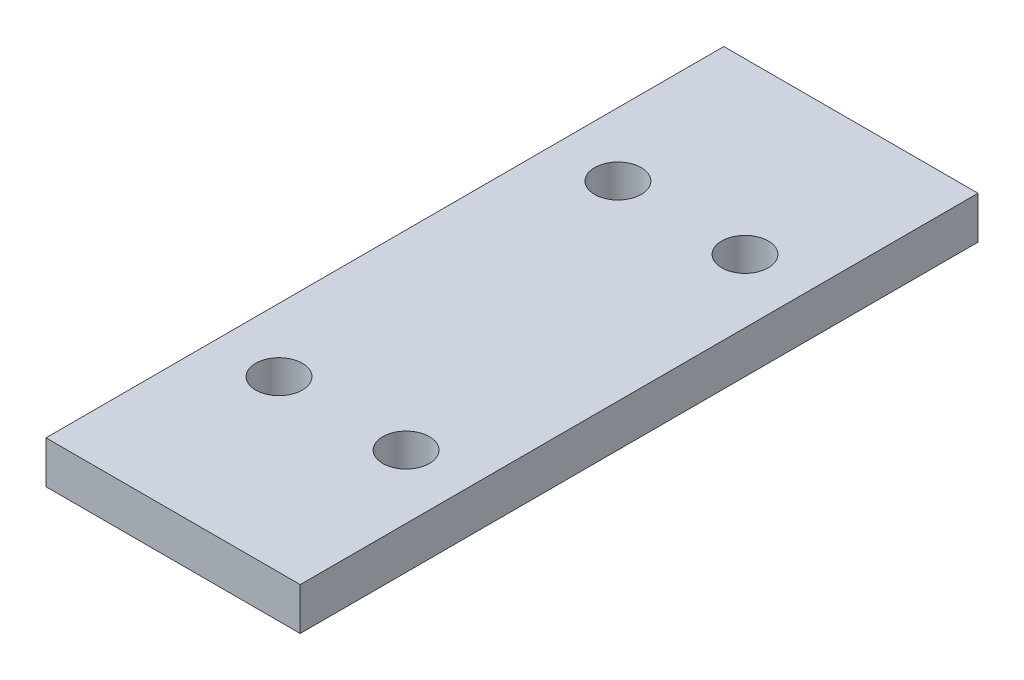
ISO-10303-21;
HEADER;
FILE_DESCRIPTION(('STEP AP214'),'2;1');
FILE_NAME('part.step','',(''),(''),'','','');
FILE_SCHEMA(('AUTOMOTIVE_DESIGN { 1 0 10303 214 1 1 1 1 }'));
ENDSEC;
DATA;
#1=APPLICATION_CONTEXT('core data for automotive mechanical design processes');
#2=APPLICATION_PROTOCOL_DEFINITION('international standard','automotive_design',2000,#1);
#3=PRODUCT_CONTEXT('',#1,'mechanical');
#4=PRODUCT('Part','Part','',(#3));
#5=PRODUCT_RELATED_PRODUCT_CATEGORY('part','',(#4));
#6=PRODUCT_DEFINITION_FORMATION('','',#4);
#7=PRODUCT_DEFINITION_CONTEXT('part definition',#1,'design');
#8=PRODUCT_DEFINITION('design','',#6,#7);
#9=PRODUCT_DEFINITION_SHAPE('','',#8);
#10=(LENGTH_UNIT() NAMED_UNIT(*) SI_UNIT(.MILLI.,.METRE.));
#11=(NAMED_UNIT(*) PLANE_ANGLE_UNIT() SI_UNIT($,.RADIAN.));
#12=(NAMED_UNIT(*) SI_UNIT($,.STERADIAN.) SOLID_ANGLE_UNIT());
#13=UNCERTAINTY_MEASURE_WITH_UNIT(LENGTH_MEASURE(1.E-05),#10,'distance_accuracy_value','');
#14=(GEOMETRIC_REPRESENTATION_CONTEXT(3) GLOBAL_UNCERTAINTY_ASSIGNED_CONTEXT((#13)) GLOBAL_UNIT_ASSIGNED_CONTEXT((#10,
#11,#12)) REPRESENTATION_CONTEXT('',''));
#15=CARTESIAN_POINT('',(0.,0.,0.));
#16=DIRECTION('',(0.,0.,1.));
#17=DIRECTION('',(1.,0.,0.));
#18=AXIS2_PLACEMENT_3D('',#15,#16,#17);
#19=CARTESIAN_POINT('',(0.,6.35,0.));
#20=DIRECTION('',(0.,1.,0.));
#21=DIRECTION('',(0.,0.,1.));
#22=AXIS2_PLACEMENT_3D('',#19,#20,#21);
#23=PLANE('',#22);
#24=CARTESIAN_POINT('',(9.525,6.35,25.4));
#25=DIRECTION('',(0.,1.,0.));
#26=DIRECTION('',(0.,0.,1.));
#27=AXIS2_PLACEMENT_3D('',#24,#25,#26);
#28=CIRCLE('',#27,3.4925);
#29=CARTESIAN_POINT('',(9.525,6.35,28.8925));
#30=VERTEX_POINT('',#29);
#31=EDGE_CURVE('E142',#30,#30,#28,.T.);
#32=ORIENTED_EDGE('',*,*,#31,.F.);
#33=EDGE_LOOP('',(#32));
#34=FACE_BOUND('',#33,.T.);
#35=CARTESIAN_POINT('',(-9.525,6.35,-25.4));
#36=DIRECTION('',(0.,1.,0.));
#37=DIRECTION('',(0.,0.,1.));
#38=AXIS2_PLACEMENT_3D('',#35,#36,#37);
#39=CIRCLE('',#38,3.4925);
#40=CARTESIAN_POINT('',(-9.525,6.35,-21.9075));
#41=VERTEX_POINT('',#40);
#42=EDGE_CURVE('E112',#41,#41,#39,.T.);
#43=ORIENTED_EDGE('',*,*,#42,.F.);
#44=EDGE_LOOP('',(#43));
#45=FACE_BOUND('',#44,.T.);
#46=DIRECTION('',(0.,0.,-1.));
#47=VECTOR('',#46,1.);
#48=CARTESIAN_POINT('',(19.05,6.35,-50.8));
#49=LINE('',#48,#47);
#50=CARTESIAN_POINT('',(19.05,6.35,50.8));
#51=VERTEX_POINT('',#50);
#52=CARTESIAN_POINT('',(19.05,6.35,-50.8));
#53=VERTEX_POINT('',#52);
#54=EDGE_CURVE('E92',#51,#53,#49,.T.);
#55=ORIENTED_EDGE('',*,*,#54,.T.);
#56=DIRECTION('',(-1.,0.,0.));
#57=VECTOR('',#56,1.);
#58=CARTESIAN_POINT('',(-19.05,6.35,-50.8));
#59=LINE('',#58,#57);
#60=CARTESIAN_POINT('',(-19.05,6.35,-50.8));
#61=VERTEX_POINT('',#60);
#62=EDGE_CURVE('E87',#53,#61,#59,.T.);
#63=ORIENTED_EDGE('',*,*,#62,.T.);
#64=DIRECTION('',(0.,0.,1.));
#65=VECTOR('',#64,1.);
#66=CARTESIAN_POINT('',(-19.05,6.35,-50.8));
#67=LINE('',#66,#65);
#68=CARTESIAN_POINT('',(-19.05,6.35,50.8));
#69=VERTEX_POINT('',#68);
#70=EDGE_CURVE('E90',#61,#69,#67,.T.);
#71=ORIENTED_EDGE('',*,*,#70,.T.);
#72=DIRECTION('',(1.,0.,0.));
#73=VECTOR('',#72,1.);
#74=CARTESIAN_POINT('',(-19.05,6.35,50.8));
#75=LINE('',#74,#73);
#76=EDGE_CURVE('E57',#69,#51,#75,.T.);
#77=ORIENTED_EDGE('',*,*,#76,.T.);
#78=EDGE_LOOP('',(#55,#63,#71,#77));
#79=FACE_BOUND('',#78,.T.);
#80=CARTESIAN_POINT('',(9.525,6.35,-25.4));
#81=DIRECTION('',(0.,1.,0.));
#82=DIRECTION('',(0.,0.,1.));
#83=AXIS2_PLACEMENT_3D('',#80,#81,#82);
#84=CIRCLE('',#83,3.4925);
#85=CARTESIAN_POINT('',(9.525,6.35,-21.9075));
#86=VERTEX_POINT('',#85);
#87=EDGE_CURVE('E134',#86,#86,#84,.T.);
#88=ORIENTED_EDGE('',*,*,#87,.F.);
#89=EDGE_LOOP('',(#88));
#90=FACE_BOUND('',#89,.T.);
#91=CARTESIAN_POINT('',(-9.525,6.35,25.4));
#92=DIRECTION('',(0.,1.,0.));
#93=DIRECTION('',(0.,0.,1.));
#94=AXIS2_PLACEMENT_3D('',#91,#92,#93);
#95=CIRCLE('',#94,3.4925);
#96=CARTESIAN_POINT('',(-9.525,6.35,28.8925));
#97=VERTEX_POINT('',#96);
#98=EDGE_CURVE('E150',#97,#97,#95,.T.);
#99=ORIENTED_EDGE('',*,*,#98,.F.);
#100=EDGE_LOOP('',(#99));
#101=FACE_BOUND('',#100,.T.);
#102=ADVANCED_FACE('F39',(#34,#45,#79,#90,#101),#23,.T.);
#103=CARTESIAN_POINT('',(0.,0.,0.));
#104=DIRECTION('',(0.,1.,0.));
#105=DIRECTION('',(0.,0.,1.));
#106=AXIS2_PLACEMENT_3D('',#103,#104,#105);
#107=PLANE('',#106);
#108=DIRECTION('',(0.,0.,-1.));
#109=VECTOR('',#108,1.);
#110=CARTESIAN_POINT('',(19.05,0.,-50.8));
#111=LINE('',#110,#109);
#112=CARTESIAN_POINT('',(19.05,0.,50.8));
#113=VERTEX_POINT('',#112);
#114=CARTESIAN_POINT('',(19.05,0.,-50.8));
#115=VERTEX_POINT('',#114);
#116=EDGE_CURVE('E108',#113,#115,#111,.T.);
#117=ORIENTED_EDGE('',*,*,#116,.F.);
#118=DIRECTION('',(1.,0.,0.));
#119=VECTOR('',#118,1.);
#120=CARTESIAN_POINT('',(-19.05,0.,50.8));
#121=LINE('',#120,#119);
#122=CARTESIAN_POINT('',(-19.05,0.,50.8));
#123=VERTEX_POINT('',#122);
#124=EDGE_CURVE('E80',#123,#113,#121,.T.);
#125=ORIENTED_EDGE('',*,*,#124,.F.);
#126=DIRECTION('',(0.,0.,1.));
#127=VECTOR('',#126,1.);
#128=CARTESIAN_POINT('',(-19.05,0.,-50.8));
#129=LINE('',#128,#127);
#130=CARTESIAN_POINT('',(-19.05,0.,-50.8));
#131=VERTEX_POINT('',#130);
#132=EDGE_CURVE('E74',#131,#123,#129,.T.);
#133=ORIENTED_EDGE('',*,*,#132,.F.);
#134=DIRECTION('',(-1.,0.,0.));
#135=VECTOR('',#134,1.);
#136=CARTESIAN_POINT('',(-19.05,0.,-50.8));
#137=LINE('',#136,#135);
#138=EDGE_CURVE('E97',#115,#131,#137,.T.);
#139=ORIENTED_EDGE('',*,*,#138,.F.);
#140=EDGE_LOOP('',(#117,#125,#133,#139));
#141=FACE_BOUND('',#140,.T.);
#142=CARTESIAN_POINT('',(-9.525,0.,-25.4));
#143=DIRECTION('',(0.,1.,0.));
#144=DIRECTION('',(0.,0.,1.));
#145=AXIS2_PLACEMENT_3D('',#142,#143,#144);
#146=CIRCLE('',#145,3.4925);
#147=CARTESIAN_POINT('',(-9.525,0.,-21.9075));
#148=VERTEX_POINT('',#147);
#149=EDGE_CURVE('E130',#148,#148,#146,.T.);
#150=ORIENTED_EDGE('',*,*,#149,.T.);
#151=EDGE_LOOP('',(#150));
#152=FACE_BOUND('',#151,.T.);
#153=CARTESIAN_POINT('',(9.525,0.,-25.4));
#154=DIRECTION('',(0.,1.,0.));
#155=DIRECTION('',(0.,0.,1.));
#156=AXIS2_PLACEMENT_3D('',#153,#154,#155);
#157=CIRCLE('',#156,3.4925);
#158=CARTESIAN_POINT('',(9.525,0.,-21.9075));
#159=VERTEX_POINT('',#158);
#160=EDGE_CURVE('E138',#159,#159,#157,.T.);
#161=ORIENTED_EDGE('',*,*,#160,.T.);
#162=EDGE_LOOP('',(#161));
#163=FACE_BOUND('',#162,.T.);
#164=CARTESIAN_POINT('',(9.525,0.,25.4));
#165=DIRECTION('',(0.,1.,0.));
#166=DIRECTION('',(0.,0.,1.));
#167=AXIS2_PLACEMENT_3D('',#164,#165,#166);
#168=CIRCLE('',#167,3.4925);
#169=CARTESIAN_POINT('',(9.525,0.,28.8925));
#170=VERTEX_POINT('',#169);
#171=EDGE_CURVE('E146',#170,#170,#168,.T.);
#172=ORIENTED_EDGE('',*,*,#171,.T.);
#173=EDGE_LOOP('',(#172));
#174=FACE_BOUND('',#173,.T.);
#175=CARTESIAN_POINT('',(-9.525,0.,25.4));
#176=DIRECTION('',(0.,1.,0.));
#177=DIRECTION('',(0.,0.,1.));
#178=AXIS2_PLACEMENT_3D('',#175,#176,#177);
#179=CIRCLE('',#178,3.4925);
#180=CARTESIAN_POINT('',(-9.525,0.,28.8925));
#181=VERTEX_POINT('',#180);
#182=EDGE_CURVE('E154',#181,#181,#179,.T.);
#183=ORIENTED_EDGE('',*,*,#182,.T.);
#184=EDGE_LOOP('',(#183));
#185=FACE_BOUND('',#184,.T.);
#186=ADVANCED_FACE('F125',(#141,#152,#163,#174,#185),#107,.F.);
#187=CARTESIAN_POINT('',(19.05,6.35,-50.8));
#188=DIRECTION('',(-1.,0.,0.));
#189=DIRECTION('',(0.,0.,1.));
#190=AXIS2_PLACEMENT_3D('',#187,#188,#189);
#191=PLANE('',#190);
#192=ORIENTED_EDGE('',*,*,#116,.T.);
#193=DIRECTION('',(0.,-1.,0.));
#194=VECTOR('',#193,1.);
#195=CARTESIAN_POINT('',(19.05,6.35,-50.8));
#196=LINE('',#195,#194);
#197=EDGE_CURVE('E11',#53,#115,#196,.T.);
#198=ORIENTED_EDGE('',*,*,#197,.F.);
#199=ORIENTED_EDGE('',*,*,#54,.F.);
#200=DIRECTION('',(0.,-1.,0.));
#201=VECTOR('',#200,1.);
#202=CARTESIAN_POINT('',(19.05,6.35,50.8));
#203=LINE('',#202,#201);
#204=EDGE_CURVE('E104',#51,#113,#203,.T.);
#205=ORIENTED_EDGE('',*,*,#204,.T.);
#206=EDGE_LOOP('',(#192,#198,#199,#205));
#207=FACE_BOUND('',#206,.T.);
#208=ADVANCED_FACE('F41',(#207),#191,.F.);
#209=CARTESIAN_POINT('',(-19.05,6.35,-50.8));
#210=DIRECTION('',(0.,0.,1.));
#211=DIRECTION('',(1.,0.,0.));
#212=AXIS2_PLACEMENT_3D('',#209,#210,#211);
#213=PLANE('',#212);
#214=ORIENTED_EDGE('',*,*,#138,.T.);
#215=DIRECTION('',(0.,-1.,0.));
#216=VECTOR('',#215,1.);
#217=CARTESIAN_POINT('',(-19.05,6.35,-50.8));
#218=LINE('',#217,#216);
#219=EDGE_CURVE('E49',#61,#131,#218,.T.);
#220=ORIENTED_EDGE('',*,*,#219,.F.);
#221=ORIENTED_EDGE('',*,*,#62,.F.);
#222=ORIENTED_EDGE('',*,*,#197,.T.);
#223=EDGE_LOOP('',(#214,#220,#221,#222));
#224=FACE_BOUND('',#223,.T.);
#225=ADVANCED_FACE('F96',(#224),#213,.F.);
#226=CARTESIAN_POINT('',(-19.05,6.35,-50.8));
#227=DIRECTION('',(1.,0.,0.));
#228=DIRECTION('',(0.,0.,-1.));
#229=AXIS2_PLACEMENT_3D('',#226,#227,#228);
#230=PLANE('',#229);
#231=ORIENTED_EDGE('',*,*,#132,.T.);
#232=DIRECTION('',(0.,-1.,0.));
#233=VECTOR('',#232,1.);
#234=CARTESIAN_POINT('',(-19.05,6.35,50.8));
#235=LINE('',#234,#233);
#236=EDGE_CURVE('E99',#69,#123,#235,.T.);
#237=ORIENTED_EDGE('',*,*,#236,.F.);
#238=ORIENTED_EDGE('',*,*,#70,.F.);
#239=ORIENTED_EDGE('',*,*,#219,.T.);
#240=EDGE_LOOP('',(#231,#237,#238,#239));
#241=FACE_BOUND('',#240,.T.);
#242=ADVANCED_FACE('F100',(#241),#230,.F.);
#243=CARTESIAN_POINT('',(-19.05,6.35,50.8));
#244=DIRECTION('',(0.,0.,-1.));
#245=DIRECTION('',(-1.,0.,0.));
#246=AXIS2_PLACEMENT_3D('',#243,#244,#245);
#247=PLANE('',#246);
#248=ORIENTED_EDGE('',*,*,#124,.T.);
#249=ORIENTED_EDGE('',*,*,#204,.F.);
#250=ORIENTED_EDGE('',*,*,#76,.F.);
#251=ORIENTED_EDGE('',*,*,#236,.T.);
#252=EDGE_LOOP('',(#248,#249,#250,#251));
#253=FACE_BOUND('',#252,.T.);
#254=ADVANCED_FACE('F122',(#253),#247,.F.);
#255=CARTESIAN_POINT('',(-9.525,6.35,-25.4));
#256=DIRECTION('',(0.,-1.,0.));
#257=DIRECTION('',(0.,0.,-1.));
#258=AXIS2_PLACEMENT_3D('',#255,#256,#257);
#259=CYLINDRICAL_SURFACE('',#258,3.4925);
#260=ORIENTED_EDGE('',*,*,#42,.T.);
#261=EDGE_LOOP('',(#260));
#262=FACE_BOUND('',#261,.T.);
#263=ORIENTED_EDGE('',*,*,#149,.F.);
#264=EDGE_LOOP('',(#263));
#265=FACE_BOUND('',#264,.T.);
#266=ADVANCED_FACE('F175',(#262,#265),#259,.F.);
#267=CARTESIAN_POINT('',(9.525,6.35,-25.4));
#268=DIRECTION('',(0.,-1.,0.));
#269=DIRECTION('',(0.,0.,-1.));
#270=AXIS2_PLACEMENT_3D('',#267,#268,#269);
#271=CYLINDRICAL_SURFACE('',#270,3.4925);
#272=ORIENTED_EDGE('',*,*,#87,.T.);
#273=EDGE_LOOP('',(#272));
#274=FACE_BOUND('',#273,.T.);
#275=ORIENTED_EDGE('',*,*,#160,.F.);
#276=EDGE_LOOP('',(#275));
#277=FACE_BOUND('',#276,.T.);
#278=ADVANCED_FACE('F221',(#274,#277),#271,.F.);
#279=CARTESIAN_POINT('',(9.525,6.35,25.4));
#280=DIRECTION('',(0.,-1.,0.));
#281=DIRECTION('',(0.,0.,-1.));
#282=AXIS2_PLACEMENT_3D('',#279,#280,#281);
#283=CYLINDRICAL_SURFACE('',#282,3.4925);
#284=ORIENTED_EDGE('',*,*,#31,.T.);
#285=EDGE_LOOP('',(#284));
#286=FACE_BOUND('',#285,.T.);
#287=ORIENTED_EDGE('',*,*,#171,.F.);
#288=EDGE_LOOP('',(#287));
#289=FACE_BOUND('',#288,.T.);
#290=ADVANCED_FACE('F229',(#286,#289),#283,.F.);
#291=CARTESIAN_POINT('',(-9.525,6.35,25.4));
#292=DIRECTION('',(0.,-1.,0.));
#293=DIRECTION('',(0.,0.,-1.));
#294=AXIS2_PLACEMENT_3D('',#291,#292,#293);
#295=CYLINDRICAL_SURFACE('',#294,3.4925);
#296=ORIENTED_EDGE('',*,*,#98,.T.);
#297=EDGE_LOOP('',(#296));
#298=FACE_BOUND('',#297,.T.);
#299=ORIENTED_EDGE('',*,*,#182,.F.);
#300=EDGE_LOOP('',(#299));
#301=FACE_BOUND('',#300,.T.);
#302=ADVANCED_FACE('F162',(#298,#301),#295,.F.);
#303=CLOSED_SHELL('',(#102,#186,#208,#225,#242,#254,#266,#278,#290,#302));
#304=MANIFOLD_SOLID_BREP('B2',#303);
#305=ADVANCED_BREP_SHAPE_REPRESENTATION('',(#18,#304),#14);
#306=SHAPE_DEFINITION_REPRESENTATION(#9,#305);
ENDSEC;
END-ISO-10303-21;
